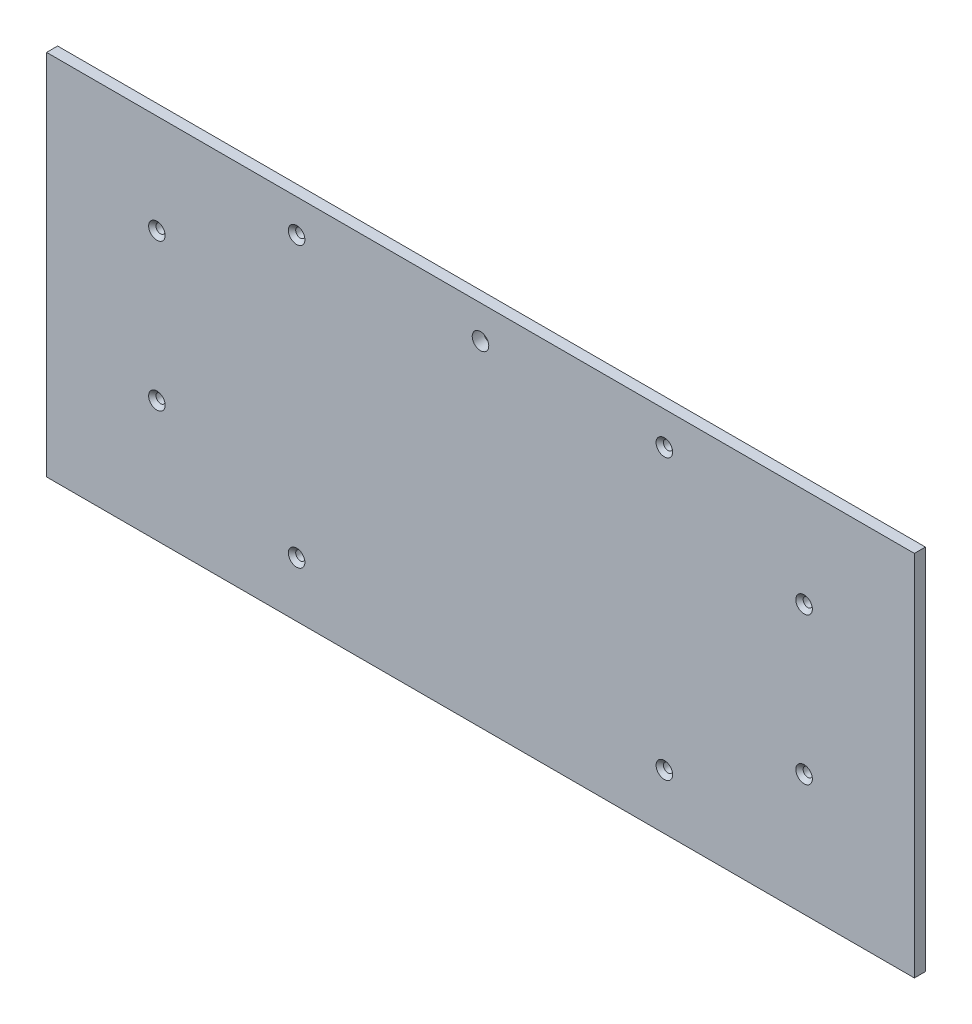
ISO-10303-21;
HEADER;
FILE_DESCRIPTION(('STEP AP214'),'2;1');
FILE_NAME('part.step','',(''),(''),'','','');
FILE_SCHEMA(('AUTOMOTIVE_DESIGN { 1 0 10303 214 1 1 1 1 }'));
ENDSEC;
DATA;
#1=APPLICATION_CONTEXT('core data for automotive mechanical design processes');
#2=APPLICATION_PROTOCOL_DEFINITION('international standard','automotive_design',2000,#1);
#3=PRODUCT_CONTEXT('',#1,'mechanical');
#4=PRODUCT('Part','Part','',(#3));
#5=PRODUCT_RELATED_PRODUCT_CATEGORY('part','',(#4));
#6=PRODUCT_DEFINITION_FORMATION('','',#4);
#7=PRODUCT_DEFINITION_CONTEXT('part definition',#1,'design');
#8=PRODUCT_DEFINITION('design','',#6,#7);
#9=PRODUCT_DEFINITION_SHAPE('','',#8);
#10=(LENGTH_UNIT() NAMED_UNIT(*) SI_UNIT(.MILLI.,.METRE.));
#11=(NAMED_UNIT(*) PLANE_ANGLE_UNIT() SI_UNIT($,.RADIAN.));
#12=(NAMED_UNIT(*) SI_UNIT($,.STERADIAN.) SOLID_ANGLE_UNIT());
#13=UNCERTAINTY_MEASURE_WITH_UNIT(LENGTH_MEASURE(1.E-05),#10,'distance_accuracy_value','');
#14=(GEOMETRIC_REPRESENTATION_CONTEXT(3) GLOBAL_UNCERTAINTY_ASSIGNED_CONTEXT((#13)) GLOBAL_UNIT_ASSIGNED_CONTEXT((#10,
#11,#12)) REPRESENTATION_CONTEXT('',''));
#15=CARTESIAN_POINT('',(0.,0.,0.));
#16=DIRECTION('',(0.,0.,1.));
#17=DIRECTION('',(1.,0.,0.));
#18=AXIS2_PLACEMENT_3D('',#15,#16,#17);
#19=CARTESIAN_POINT('',(236.,-100.,6.));
#20=DIRECTION('',(-1.,0.,0.));
#21=DIRECTION('',(0.,0.,1.));
#22=AXIS2_PLACEMENT_3D('',#19,#20,#21);
#23=PLANE('',#22);
#24=DIRECTION('',(0.,1.,0.));
#25=VECTOR('',#24,1.);
#26=CARTESIAN_POINT('',(236.,-100.,0.));
#27=LINE('',#26,#25);
#28=CARTESIAN_POINT('',(236.,-100.,0.));
#29=VERTEX_POINT('',#28);
#30=CARTESIAN_POINT('',(236.,100.,0.));
#31=VERTEX_POINT('',#30);
#32=EDGE_CURVE('E120',#29,#31,#27,.T.);
#33=ORIENTED_EDGE('',*,*,#32,.T.);
#34=DIRECTION('',(0.,0.,-1.));
#35=VECTOR('',#34,1.);
#36=CARTESIAN_POINT('',(236.,100.,6.));
#37=LINE('',#36,#35);
#38=CARTESIAN_POINT('',(236.,100.,6.));
#39=VERTEX_POINT('',#38);
#40=EDGE_CURVE('E108',#39,#31,#37,.T.);
#41=ORIENTED_EDGE('',*,*,#40,.F.);
#42=DIRECTION('',(0.,1.,0.));
#43=VECTOR('',#42,1.);
#44=CARTESIAN_POINT('',(236.,-100.,6.));
#45=LINE('',#44,#43);
#46=CARTESIAN_POINT('',(236.,-100.,6.));
#47=VERTEX_POINT('',#46);
#48=EDGE_CURVE('E100',#47,#39,#45,.T.);
#49=ORIENTED_EDGE('',*,*,#48,.F.);
#50=DIRECTION('',(0.,0.,-1.));
#51=VECTOR('',#50,1.);
#52=CARTESIAN_POINT('',(236.,-100.,6.));
#53=LINE('',#52,#51);
#54=EDGE_CURVE('E116',#47,#29,#53,.T.);
#55=ORIENTED_EDGE('',*,*,#54,.T.);
#56=EDGE_LOOP('',(#33,#41,#49,#55));
#57=FACE_BOUND('',#56,.T.);
#58=ADVANCED_FACE('F45',(#57),#23,.F.);
#59=CARTESIAN_POINT('',(-236.,100.,6.));
#60=DIRECTION('',(0.,-1.,0.));
#61=DIRECTION('',(0.,0.,-1.));
#62=AXIS2_PLACEMENT_3D('',#59,#60,#61);
#63=PLANE('',#62);
#64=DIRECTION('',(-1.,0.,0.));
#65=VECTOR('',#64,1.);
#66=CARTESIAN_POINT('',(-236.,100.,0.));
#67=LINE('',#66,#65);
#68=CARTESIAN_POINT('',(-236.,100.,0.));
#69=VERTEX_POINT('',#68);
#70=EDGE_CURVE('E106',#31,#69,#67,.T.);
#71=ORIENTED_EDGE('',*,*,#70,.T.);
#72=DIRECTION('',(0.,0.,-1.));
#73=VECTOR('',#72,1.);
#74=CARTESIAN_POINT('',(-236.,100.,6.));
#75=LINE('',#74,#73);
#76=CARTESIAN_POINT('',(-236.,100.,6.));
#77=VERTEX_POINT('',#76);
#78=EDGE_CURVE('E104',#77,#69,#75,.T.);
#79=ORIENTED_EDGE('',*,*,#78,.F.);
#80=DIRECTION('',(-1.,0.,0.));
#81=VECTOR('',#80,1.);
#82=CARTESIAN_POINT('',(-236.,100.,6.));
#83=LINE('',#82,#81);
#84=EDGE_CURVE('E95',#39,#77,#83,.T.);
#85=ORIENTED_EDGE('',*,*,#84,.F.);
#86=ORIENTED_EDGE('',*,*,#40,.T.);
#87=EDGE_LOOP('',(#71,#79,#85,#86));
#88=FACE_BOUND('',#87,.T.);
#89=ADVANCED_FACE('F105',(#88),#63,.F.);
#90=CARTESIAN_POINT('',(-236.,-100.,6.));
#91=DIRECTION('',(1.,0.,0.));
#92=DIRECTION('',(0.,0.,-1.));
#93=AXIS2_PLACEMENT_3D('',#90,#91,#92);
#94=PLANE('',#93);
#95=DIRECTION('',(0.,-1.,0.));
#96=VECTOR('',#95,1.);
#97=CARTESIAN_POINT('',(-236.,-100.,0.));
#98=LINE('',#97,#96);
#99=CARTESIAN_POINT('',(-236.,-100.,0.));
#100=VERTEX_POINT('',#99);
#101=EDGE_CURVE('E81',#69,#100,#98,.T.);
#102=ORIENTED_EDGE('',*,*,#101,.T.);
#103=DIRECTION('',(0.,0.,-1.));
#104=VECTOR('',#103,1.);
#105=CARTESIAN_POINT('',(-236.,-100.,6.));
#106=LINE('',#105,#104);
#107=CARTESIAN_POINT('',(-236.,-100.,6.));
#108=VERTEX_POINT('',#107);
#109=EDGE_CURVE('E109',#108,#100,#106,.T.);
#110=ORIENTED_EDGE('',*,*,#109,.F.);
#111=DIRECTION('',(0.,-1.,0.));
#112=VECTOR('',#111,1.);
#113=CARTESIAN_POINT('',(-236.,-100.,6.));
#114=LINE('',#113,#112);
#115=EDGE_CURVE('E98',#77,#108,#114,.T.);
#116=ORIENTED_EDGE('',*,*,#115,.F.);
#117=ORIENTED_EDGE('',*,*,#78,.T.);
#118=EDGE_LOOP('',(#102,#110,#116,#117));
#119=FACE_BOUND('',#118,.T.);
#120=ADVANCED_FACE('F111',(#119),#94,.F.);
#121=CARTESIAN_POINT('',(-236.,-100.,6.));
#122=DIRECTION('',(0.,1.,0.));
#123=DIRECTION('',(0.,0.,1.));
#124=AXIS2_PLACEMENT_3D('',#121,#122,#123);
#125=PLANE('',#124);
#126=DIRECTION('',(1.,0.,0.));
#127=VECTOR('',#126,1.);
#128=CARTESIAN_POINT('',(-236.,-100.,0.));
#129=LINE('',#128,#127);
#130=EDGE_CURVE('E87',#100,#29,#129,.T.);
#131=ORIENTED_EDGE('',*,*,#130,.T.);
#132=ORIENTED_EDGE('',*,*,#54,.F.);
#133=DIRECTION('',(1.,0.,0.));
#134=VECTOR('',#133,1.);
#135=CARTESIAN_POINT('',(-236.,-100.,6.));
#136=LINE('',#135,#134);
#137=EDGE_CURVE('E64',#108,#47,#136,.T.);
#138=ORIENTED_EDGE('',*,*,#137,.F.);
#139=ORIENTED_EDGE('',*,*,#109,.T.);
#140=EDGE_LOOP('',(#131,#132,#138,#139));
#141=FACE_BOUND('',#140,.T.);
#142=ADVANCED_FACE('F342',(#141),#125,.F.);
#143=CARTESIAN_POINT('',(0.,0.,6.));
#144=DIRECTION('',(0.,0.,-1.));
#145=DIRECTION('',(-1.,0.,0.));
#146=AXIS2_PLACEMENT_3D('',#143,#144,#145);
#147=PLANE('',#146);
#148=CARTESIAN_POINT('',(0.,82.,6.));
#149=DIRECTION('',(0.,0.,1.));
#150=DIRECTION('',(1.,0.,0.));
#151=AXIS2_PLACEMENT_3D('',#148,#149,#150);
#152=CIRCLE('',#151,4.5);
#153=CARTESIAN_POINT('',(4.5,82.,6.));
#154=VERTEX_POINT('',#153);
#155=EDGE_CURVE('E324',#154,#154,#152,.T.);
#156=ORIENTED_EDGE('',*,*,#155,.F.);
#157=EDGE_LOOP('',(#156));
#158=FACE_BOUND('',#157,.T.);
#159=CARTESIAN_POINT('',(-176.,-34.,6.));
#160=DIRECTION('',(0.,0.,-1.));
#161=DIRECTION('',(-1.,0.,0.));
#162=AXIS2_PLACEMENT_3D('',#159,#160,#161);
#163=CIRCLE('',#162,4.49999999999995);
#164=CARTESIAN_POINT('',(-180.5,-34.,6.));
#165=VERTEX_POINT('',#164);
#166=EDGE_CURVE('E169',#165,#165,#163,.T.);
#167=ORIENTED_EDGE('',*,*,#166,.T.);
#168=EDGE_LOOP('',(#167));
#169=FACE_BOUND('',#168,.T.);
#170=CARTESIAN_POINT('',(-176.,46.,6.));
#171=DIRECTION('',(0.,0.,-1.));
#172=DIRECTION('',(-1.,0.,0.));
#173=AXIS2_PLACEMENT_3D('',#170,#171,#172);
#174=CIRCLE('',#173,4.49999999999995);
#175=CARTESIAN_POINT('',(-180.5,46.,6.));
#176=VERTEX_POINT('',#175);
#177=EDGE_CURVE('E165',#176,#176,#174,.T.);
#178=ORIENTED_EDGE('',*,*,#177,.T.);
#179=EDGE_LOOP('',(#178));
#180=FACE_BOUND('',#179,.T.);
#181=CARTESIAN_POINT('',(176.,46.,6.));
#182=DIRECTION('',(0.,0.,-1.));
#183=DIRECTION('',(-1.,0.,0.));
#184=AXIS2_PLACEMENT_3D('',#181,#182,#183);
#185=CIRCLE('',#184,4.49999999999995);
#186=CARTESIAN_POINT('',(171.5,46.,6.));
#187=VERTEX_POINT('',#186);
#188=EDGE_CURVE('E161',#187,#187,#185,.T.);
#189=ORIENTED_EDGE('',*,*,#188,.T.);
#190=EDGE_LOOP('',(#189));
#191=FACE_BOUND('',#190,.T.);
#192=CARTESIAN_POINT('',(176.,-34.,6.));
#193=DIRECTION('',(0.,0.,-1.));
#194=DIRECTION('',(-1.,0.,0.));
#195=AXIS2_PLACEMENT_3D('',#192,#193,#194);
#196=CIRCLE('',#195,4.49999999999995);
#197=CARTESIAN_POINT('',(171.5,-34.,6.));
#198=VERTEX_POINT('',#197);
#199=EDGE_CURVE('E157',#198,#198,#196,.T.);
#200=ORIENTED_EDGE('',*,*,#199,.T.);
#201=EDGE_LOOP('',(#200));
#202=FACE_BOUND('',#201,.T.);
#203=CARTESIAN_POINT('',(100.,82.,6.));
#204=DIRECTION('',(0.,0.,-1.));
#205=DIRECTION('',(-1.,0.,0.));
#206=AXIS2_PLACEMENT_3D('',#203,#204,#205);
#207=CIRCLE('',#206,4.49999999999995);
#208=CARTESIAN_POINT('',(95.5000000000001,82.,6.));
#209=VERTEX_POINT('',#208);
#210=EDGE_CURVE('E153',#209,#209,#207,.T.);
#211=ORIENTED_EDGE('',*,*,#210,.T.);
#212=EDGE_LOOP('',(#211));
#213=FACE_BOUND('',#212,.T.);
#214=CARTESIAN_POINT('',(-100.,82.,6.));
#215=DIRECTION('',(0.,0.,-1.));
#216=DIRECTION('',(-1.,0.,0.));
#217=AXIS2_PLACEMENT_3D('',#214,#215,#216);
#218=CIRCLE('',#217,4.50000000000012);
#219=CARTESIAN_POINT('',(-104.5,82.,6.));
#220=VERTEX_POINT('',#219);
#221=EDGE_CURVE('E149',#220,#220,#218,.T.);
#222=ORIENTED_EDGE('',*,*,#221,.T.);
#223=EDGE_LOOP('',(#222));
#224=FACE_BOUND('',#223,.T.);
#225=CARTESIAN_POINT('',(-100.,-70.,6.));
#226=DIRECTION('',(0.,0.,-1.));
#227=DIRECTION('',(-1.,0.,0.));
#228=AXIS2_PLACEMENT_3D('',#225,#226,#227);
#229=CIRCLE('',#228,4.50000000000012);
#230=CARTESIAN_POINT('',(-104.5,-70.,6.));
#231=VERTEX_POINT('',#230);
#232=EDGE_CURVE('E145',#231,#231,#229,.T.);
#233=ORIENTED_EDGE('',*,*,#232,.T.);
#234=EDGE_LOOP('',(#233));
#235=FACE_BOUND('',#234,.T.);
#236=CARTESIAN_POINT('',(100.,-70.,6.));
#237=DIRECTION('',(0.,0.,-1.));
#238=DIRECTION('',(-1.,0.,0.));
#239=AXIS2_PLACEMENT_3D('',#236,#237,#238);
#240=CIRCLE('',#239,4.49999999999995);
#241=CARTESIAN_POINT('',(95.5000000000001,-70.,6.));
#242=VERTEX_POINT('',#241);
#243=EDGE_CURVE('E141',#242,#242,#240,.T.);
#244=ORIENTED_EDGE('',*,*,#243,.T.);
#245=EDGE_LOOP('',(#244));
#246=FACE_BOUND('',#245,.T.);
#247=ORIENTED_EDGE('',*,*,#48,.T.);
#248=ORIENTED_EDGE('',*,*,#84,.T.);
#249=ORIENTED_EDGE('',*,*,#115,.T.);
#250=ORIENTED_EDGE('',*,*,#137,.T.);
#251=EDGE_LOOP('',(#247,#248,#249,#250));
#252=FACE_BOUND('',#251,.T.);
#253=ADVANCED_FACE('F96',(#158,#169,#180,#191,#202,#213,#224,#235,#246,#252),#147,.F.);
#254=CARTESIAN_POINT('',(0.,0.,0.));
#255=DIRECTION('',(0.,0.,-1.));
#256=DIRECTION('',(-1.,0.,0.));
#257=AXIS2_PLACEMENT_3D('',#254,#255,#256);
#258=PLANE('',#257);
#259=CARTESIAN_POINT('',(0.,82.,0.));
#260=DIRECTION('',(0.,0.,1.));
#261=DIRECTION('',(1.,0.,0.));
#262=AXIS2_PLACEMENT_3D('',#259,#260,#261);
#263=CIRCLE('',#262,4.5);
#264=CARTESIAN_POINT('',(4.5,82.,0.));
#265=VERTEX_POINT('',#264);
#266=EDGE_CURVE('E323',#265,#265,#263,.T.);
#267=ORIENTED_EDGE('',*,*,#266,.T.);
#268=EDGE_LOOP('',(#267));
#269=FACE_BOUND('',#268,.T.);
#270=CARTESIAN_POINT('',(-100.,-70.,0.));
#271=DIRECTION('',(0.,0.,1.));
#272=DIRECTION('',(1.,0.,0.));
#273=AXIS2_PLACEMENT_3D('',#270,#271,#272);
#274=CIRCLE('',#273,2.5);
#275=CARTESIAN_POINT('',(-97.5,-70.,0.));
#276=VERTEX_POINT('',#275);
#277=EDGE_CURVE('E288',#276,#276,#274,.T.);
#278=ORIENTED_EDGE('',*,*,#277,.T.);
#279=EDGE_LOOP('',(#278));
#280=FACE_BOUND('',#279,.T.);
#281=CARTESIAN_POINT('',(-100.,82.,0.));
#282=DIRECTION('',(0.,0.,1.));
#283=DIRECTION('',(1.,0.,0.));
#284=AXIS2_PLACEMENT_3D('',#281,#282,#283);
#285=CIRCLE('',#284,2.5);
#286=CARTESIAN_POINT('',(-97.5,82.,0.));
#287=VERTEX_POINT('',#286);
#288=EDGE_CURVE('E281',#287,#287,#285,.T.);
#289=ORIENTED_EDGE('',*,*,#288,.T.);
#290=EDGE_LOOP('',(#289));
#291=FACE_BOUND('',#290,.T.);
#292=CARTESIAN_POINT('',(100.,82.,0.));
#293=DIRECTION('',(0.,0.,1.));
#294=DIRECTION('',(1.,0.,0.));
#295=AXIS2_PLACEMENT_3D('',#292,#293,#294);
#296=CIRCLE('',#295,2.5);
#297=CARTESIAN_POINT('',(102.5,82.,0.));
#298=VERTEX_POINT('',#297);
#299=EDGE_CURVE('E278',#298,#298,#296,.T.);
#300=ORIENTED_EDGE('',*,*,#299,.T.);
#301=EDGE_LOOP('',(#300));
#302=FACE_BOUND('',#301,.T.);
#303=CARTESIAN_POINT('',(176.,46.,0.));
#304=DIRECTION('',(0.,0.,1.));
#305=DIRECTION('',(1.,0.,0.));
#306=AXIS2_PLACEMENT_3D('',#303,#304,#305);
#307=CIRCLE('',#306,2.5);
#308=CARTESIAN_POINT('',(178.5,46.,0.));
#309=VERTEX_POINT('',#308);
#310=EDGE_CURVE('E282',#309,#309,#307,.T.);
#311=ORIENTED_EDGE('',*,*,#310,.T.);
#312=EDGE_LOOP('',(#311));
#313=FACE_BOUND('',#312,.T.);
#314=CARTESIAN_POINT('',(-176.,-34.,0.));
#315=DIRECTION('',(0.,0.,1.));
#316=DIRECTION('',(1.,0.,0.));
#317=AXIS2_PLACEMENT_3D('',#314,#315,#316);
#318=CIRCLE('',#317,2.5);
#319=CARTESIAN_POINT('',(-173.5,-34.,0.));
#320=VERTEX_POINT('',#319);
#321=EDGE_CURVE('E316',#320,#320,#318,.T.);
#322=ORIENTED_EDGE('',*,*,#321,.T.);
#323=EDGE_LOOP('',(#322));
#324=FACE_BOUND('',#323,.T.);
#325=CARTESIAN_POINT('',(-176.,46.,0.));
#326=DIRECTION('',(0.,0.,1.));
#327=DIRECTION('',(1.,0.,0.));
#328=AXIS2_PLACEMENT_3D('',#325,#326,#327);
#329=CIRCLE('',#328,2.5);
#330=CARTESIAN_POINT('',(-173.5,46.,0.));
#331=VERTEX_POINT('',#330);
#332=EDGE_CURVE('E312',#331,#331,#329,.T.);
#333=ORIENTED_EDGE('',*,*,#332,.T.);
#334=EDGE_LOOP('',(#333));
#335=FACE_BOUND('',#334,.T.);
#336=CARTESIAN_POINT('',(176.,-34.,0.));
#337=DIRECTION('',(0.,0.,1.));
#338=DIRECTION('',(1.,0.,0.));
#339=AXIS2_PLACEMENT_3D('',#336,#337,#338);
#340=CIRCLE('',#339,2.5);
#341=CARTESIAN_POINT('',(178.5,-34.,0.));
#342=VERTEX_POINT('',#341);
#343=EDGE_CURVE('E291',#342,#342,#340,.T.);
#344=ORIENTED_EDGE('',*,*,#343,.T.);
#345=EDGE_LOOP('',(#344));
#346=FACE_BOUND('',#345,.T.);
#347=CARTESIAN_POINT('',(100.,-70.,0.));
#348=DIRECTION('',(0.,0.,1.));
#349=DIRECTION('',(1.,0.,0.));
#350=AXIS2_PLACEMENT_3D('',#347,#348,#349);
#351=CIRCLE('',#350,2.5);
#352=CARTESIAN_POINT('',(102.5,-70.,0.));
#353=VERTEX_POINT('',#352);
#354=EDGE_CURVE('E124',#353,#353,#351,.T.);
#355=ORIENTED_EDGE('',*,*,#354,.T.);
#356=EDGE_LOOP('',(#355));
#357=FACE_BOUND('',#356,.T.);
#358=ORIENTED_EDGE('',*,*,#32,.F.);
#359=ORIENTED_EDGE('',*,*,#130,.F.);
#360=ORIENTED_EDGE('',*,*,#101,.F.);
#361=ORIENTED_EDGE('',*,*,#70,.F.);
#362=EDGE_LOOP('',(#358,#359,#360,#361));
#363=FACE_BOUND('',#362,.T.);
#364=ADVANCED_FACE('F333',(#269,#280,#291,#302,#313,#324,#335,#346,#357,#363),#258,.T.);
#365=CARTESIAN_POINT('',(100.,-70.,0.));
#366=DIRECTION('',(0.,0.,1.));
#367=DIRECTION('',(1.,0.,0.));
#368=AXIS2_PLACEMENT_3D('',#365,#366,#367);
#369=CYLINDRICAL_SURFACE('',#368,2.5);
#370=CARTESIAN_POINT('',(100.,-70.,4.00000000000009));
#371=DIRECTION('',(0.,0.,-1.));
#372=DIRECTION('',(-1.,0.,0.));
#373=AXIS2_PLACEMENT_3D('',#370,#371,#372);
#374=CIRCLE('',#373,2.5);
#375=CARTESIAN_POINT('',(97.5,-70.,4.00000000000009));
#376=VERTEX_POINT('',#375);
#377=EDGE_CURVE('E11',#376,#376,#374,.F.);
#378=ORIENTED_EDGE('',*,*,#377,.T.);
#379=EDGE_LOOP('',(#378));
#380=FACE_BOUND('',#379,.T.);
#381=ORIENTED_EDGE('',*,*,#354,.F.);
#382=EDGE_LOOP('',(#381));
#383=FACE_BOUND('',#382,.T.);
#384=ADVANCED_FACE('F360',(#380,#383),#369,.F.);
#385=CARTESIAN_POINT('',(176.,-34.,0.));
#386=DIRECTION('',(0.,0.,1.));
#387=DIRECTION('',(1.,0.,0.));
#388=AXIS2_PLACEMENT_3D('',#385,#386,#387);
#389=CYLINDRICAL_SURFACE('',#388,2.5);
#390=CARTESIAN_POINT('',(176.,-34.,4.00000000000009));
#391=DIRECTION('',(0.,0.,-1.));
#392=DIRECTION('',(-1.,0.,0.));
#393=AXIS2_PLACEMENT_3D('',#390,#391,#392);
#394=CIRCLE('',#393,2.5);
#395=CARTESIAN_POINT('',(173.5,-34.,4.00000000000009));
#396=VERTEX_POINT('',#395);
#397=EDGE_CURVE('E181',#396,#396,#394,.F.);
#398=ORIENTED_EDGE('',*,*,#397,.T.);
#399=EDGE_LOOP('',(#398));
#400=FACE_BOUND('',#399,.T.);
#401=ORIENTED_EDGE('',*,*,#343,.F.);
#402=EDGE_LOOP('',(#401));
#403=FACE_BOUND('',#402,.T.);
#404=ADVANCED_FACE('F363',(#400,#403),#389,.F.);
#405=CARTESIAN_POINT('',(-176.,46.,0.));
#406=DIRECTION('',(0.,0.,1.));
#407=DIRECTION('',(1.,0.,0.));
#408=AXIS2_PLACEMENT_3D('',#405,#406,#407);
#409=CYLINDRICAL_SURFACE('',#408,2.5);
#410=CARTESIAN_POINT('',(-176.,46.,4.00000000000009));
#411=DIRECTION('',(0.,0.,-1.));
#412=DIRECTION('',(-1.,0.,0.));
#413=AXIS2_PLACEMENT_3D('',#410,#411,#412);
#414=CIRCLE('',#413,2.5);
#415=CARTESIAN_POINT('',(-178.5,46.,4.00000000000009));
#416=VERTEX_POINT('',#415);
#417=EDGE_CURVE('E173',#416,#416,#414,.F.);
#418=ORIENTED_EDGE('',*,*,#417,.T.);
#419=EDGE_LOOP('',(#418));
#420=FACE_BOUND('',#419,.T.);
#421=ORIENTED_EDGE('',*,*,#332,.F.);
#422=EDGE_LOOP('',(#421));
#423=FACE_BOUND('',#422,.T.);
#424=ADVANCED_FACE('F386',(#420,#423),#409,.F.);
#425=CARTESIAN_POINT('',(-176.,-34.,0.));
#426=DIRECTION('',(0.,0.,1.));
#427=DIRECTION('',(1.,0.,0.));
#428=AXIS2_PLACEMENT_3D('',#425,#426,#427);
#429=CYLINDRICAL_SURFACE('',#428,2.5);
#430=CARTESIAN_POINT('',(-176.,-34.,4.00000000000009));
#431=DIRECTION('',(0.,0.,-1.));
#432=DIRECTION('',(-1.,0.,0.));
#433=AXIS2_PLACEMENT_3D('',#430,#431,#432);
#434=CIRCLE('',#433,2.5);
#435=CARTESIAN_POINT('',(-178.5,-34.,4.00000000000009));
#436=VERTEX_POINT('',#435);
#437=EDGE_CURVE('E137',#436,#436,#434,.F.);
#438=ORIENTED_EDGE('',*,*,#437,.T.);
#439=EDGE_LOOP('',(#438));
#440=FACE_BOUND('',#439,.T.);
#441=ORIENTED_EDGE('',*,*,#321,.F.);
#442=EDGE_LOOP('',(#441));
#443=FACE_BOUND('',#442,.T.);
#444=ADVANCED_FACE('F378',(#440,#443),#429,.F.);
#445=CARTESIAN_POINT('',(176.,46.,0.));
#446=DIRECTION('',(0.,0.,1.));
#447=DIRECTION('',(1.,0.,0.));
#448=AXIS2_PLACEMENT_3D('',#445,#446,#447);
#449=CYLINDRICAL_SURFACE('',#448,2.5);
#450=CARTESIAN_POINT('',(176.,46.,4.00000000000009));
#451=DIRECTION('',(0.,0.,-1.));
#452=DIRECTION('',(-1.,0.,0.));
#453=AXIS2_PLACEMENT_3D('',#450,#451,#452);
#454=CIRCLE('',#453,2.5);
#455=CARTESIAN_POINT('',(173.5,46.,4.00000000000009));
#456=VERTEX_POINT('',#455);
#457=EDGE_CURVE('E177',#456,#456,#454,.F.);
#458=ORIENTED_EDGE('',*,*,#457,.T.);
#459=EDGE_LOOP('',(#458));
#460=FACE_BOUND('',#459,.T.);
#461=ORIENTED_EDGE('',*,*,#310,.F.);
#462=EDGE_LOOP('',(#461));
#463=FACE_BOUND('',#462,.T.);
#464=ADVANCED_FACE('F274',(#460,#463),#449,.F.);
#465=CARTESIAN_POINT('',(100.,82.,0.));
#466=DIRECTION('',(0.,0.,1.));
#467=DIRECTION('',(1.,0.,0.));
#468=AXIS2_PLACEMENT_3D('',#465,#466,#467);
#469=CYLINDRICAL_SURFACE('',#468,2.5);
#470=CARTESIAN_POINT('',(100.,82.,4.00000000000009));
#471=DIRECTION('',(0.,0.,-1.));
#472=DIRECTION('',(-1.,0.,0.));
#473=AXIS2_PLACEMENT_3D('',#470,#471,#472);
#474=CIRCLE('',#473,2.5);
#475=CARTESIAN_POINT('',(97.5,82.,4.00000000000009));
#476=VERTEX_POINT('',#475);
#477=EDGE_CURVE('E185',#476,#476,#474,.F.);
#478=ORIENTED_EDGE('',*,*,#477,.T.);
#479=EDGE_LOOP('',(#478));
#480=FACE_BOUND('',#479,.T.);
#481=ORIENTED_EDGE('',*,*,#299,.F.);
#482=EDGE_LOOP('',(#481));
#483=FACE_BOUND('',#482,.T.);
#484=ADVANCED_FACE('F270',(#480,#483),#469,.F.);
#485=CARTESIAN_POINT('',(-100.,82.,0.));
#486=DIRECTION('',(0.,0.,1.));
#487=DIRECTION('',(1.,0.,0.));
#488=AXIS2_PLACEMENT_3D('',#485,#486,#487);
#489=CYLINDRICAL_SURFACE('',#488,2.5);
#490=CARTESIAN_POINT('',(-100.,82.,3.99999999999993));
#491=DIRECTION('',(0.,0.,-1.));
#492=DIRECTION('',(-1.,0.,0.));
#493=AXIS2_PLACEMENT_3D('',#490,#491,#492);
#494=CIRCLE('',#493,2.5);
#495=CARTESIAN_POINT('',(-102.5,82.,3.99999999999993));
#496=VERTEX_POINT('',#495);
#497=EDGE_CURVE('E189',#496,#496,#494,.F.);
#498=ORIENTED_EDGE('',*,*,#497,.T.);
#499=EDGE_LOOP('',(#498));
#500=FACE_BOUND('',#499,.T.);
#501=ORIENTED_EDGE('',*,*,#288,.F.);
#502=EDGE_LOOP('',(#501));
#503=FACE_BOUND('',#502,.T.);
#504=ADVANCED_FACE('F273',(#500,#503),#489,.F.);
#505=CARTESIAN_POINT('',(-100.,-70.,0.));
#506=DIRECTION('',(0.,0.,1.));
#507=DIRECTION('',(1.,0.,0.));
#508=AXIS2_PLACEMENT_3D('',#505,#506,#507);
#509=CYLINDRICAL_SURFACE('',#508,2.5);
#510=CARTESIAN_POINT('',(-100.,-70.,3.99999999999993));
#511=DIRECTION('',(0.,0.,-1.));
#512=DIRECTION('',(-1.,0.,0.));
#513=AXIS2_PLACEMENT_3D('',#510,#511,#512);
#514=CIRCLE('',#513,2.5);
#515=CARTESIAN_POINT('',(-102.5,-70.,3.99999999999993));
#516=VERTEX_POINT('',#515);
#517=EDGE_CURVE('E56',#516,#516,#514,.F.);
#518=ORIENTED_EDGE('',*,*,#517,.T.);
#519=EDGE_LOOP('',(#518));
#520=FACE_BOUND('',#519,.T.);
#521=ORIENTED_EDGE('',*,*,#277,.F.);
#522=EDGE_LOOP('',(#521));
#523=FACE_BOUND('',#522,.T.);
#524=ADVANCED_FACE('F197',(#520,#523),#509,.F.);
#525=CARTESIAN_POINT('',(-176.,-34.,4.00000000000009));
#526=DIRECTION('',(0.,0.,1.));
#527=DIRECTION('',(1.,0.,0.));
#528=AXIS2_PLACEMENT_3D('',#525,#526,#527);
#529=CONICAL_SURFACE('',#528,2.5,0.78539816339746);
#530=ORIENTED_EDGE('',*,*,#166,.F.);
#531=EDGE_LOOP('',(#530));
#532=FACE_BOUND('',#531,.T.);
#533=ORIENTED_EDGE('',*,*,#437,.F.);
#534=EDGE_LOOP('',(#533));
#535=FACE_BOUND('',#534,.T.);
#536=ADVANCED_FACE('F225',(#532,#535),#529,.F.);
#537=CARTESIAN_POINT('',(-176.,46.,4.00000000000009));
#538=DIRECTION('',(0.,0.,1.));
#539=DIRECTION('',(1.,0.,0.));
#540=AXIS2_PLACEMENT_3D('',#537,#538,#539);
#541=CONICAL_SURFACE('',#540,2.5,0.78539816339746);
#542=ORIENTED_EDGE('',*,*,#177,.F.);
#543=EDGE_LOOP('',(#542));
#544=FACE_BOUND('',#543,.T.);
#545=ORIENTED_EDGE('',*,*,#417,.F.);
#546=EDGE_LOOP('',(#545));
#547=FACE_BOUND('',#546,.T.);
#548=ADVANCED_FACE('F231',(#544,#547),#541,.F.);
#549=CARTESIAN_POINT('',(176.,46.,4.00000000000009));
#550=DIRECTION('',(0.,0.,1.));
#551=DIRECTION('',(1.,0.,0.));
#552=AXIS2_PLACEMENT_3D('',#549,#550,#551);
#553=CONICAL_SURFACE('',#552,2.5,0.78539816339746);
#554=ORIENTED_EDGE('',*,*,#188,.F.);
#555=EDGE_LOOP('',(#554));
#556=FACE_BOUND('',#555,.T.);
#557=ORIENTED_EDGE('',*,*,#457,.F.);
#558=EDGE_LOOP('',(#557));
#559=FACE_BOUND('',#558,.T.);
#560=ADVANCED_FACE('F238',(#556,#559),#553,.F.);
#561=CARTESIAN_POINT('',(176.,-34.,4.00000000000009));
#562=DIRECTION('',(0.,0.,1.));
#563=DIRECTION('',(1.,0.,0.));
#564=AXIS2_PLACEMENT_3D('',#561,#562,#563);
#565=CONICAL_SURFACE('',#564,2.5,0.78539816339746);
#566=ORIENTED_EDGE('',*,*,#199,.F.);
#567=EDGE_LOOP('',(#566));
#568=FACE_BOUND('',#567,.T.);
#569=ORIENTED_EDGE('',*,*,#397,.F.);
#570=EDGE_LOOP('',(#569));
#571=FACE_BOUND('',#570,.T.);
#572=ADVANCED_FACE('F245',(#568,#571),#565,.F.);
#573=CARTESIAN_POINT('',(100.,82.,4.00000000000009));
#574=DIRECTION('',(0.,0.,1.));
#575=DIRECTION('',(1.,0.,0.));
#576=AXIS2_PLACEMENT_3D('',#573,#574,#575);
#577=CONICAL_SURFACE('',#576,2.5,0.78539816339746);
#578=ORIENTED_EDGE('',*,*,#210,.F.);
#579=EDGE_LOOP('',(#578));
#580=FACE_BOUND('',#579,.T.);
#581=ORIENTED_EDGE('',*,*,#477,.F.);
#582=EDGE_LOOP('',(#581));
#583=FACE_BOUND('',#582,.T.);
#584=ADVANCED_FACE('F210',(#580,#583),#577,.F.);
#585=CARTESIAN_POINT('',(-100.,82.,3.99999999999993));
#586=DIRECTION('',(0.,0.,1.));
#587=DIRECTION('',(1.,0.,0.));
#588=AXIS2_PLACEMENT_3D('',#585,#586,#587);
#589=CONICAL_SURFACE('',#588,2.5,0.78539816339746);
#590=ORIENTED_EDGE('',*,*,#221,.F.);
#591=EDGE_LOOP('',(#590));
#592=FACE_BOUND('',#591,.T.);
#593=ORIENTED_EDGE('',*,*,#497,.F.);
#594=EDGE_LOOP('',(#593));
#595=FACE_BOUND('',#594,.T.);
#596=ADVANCED_FACE('F202',(#592,#595),#589,.F.);
#597=CARTESIAN_POINT('',(-100.,-70.,3.99999999999993));
#598=DIRECTION('',(0.,0.,1.));
#599=DIRECTION('',(1.,0.,0.));
#600=AXIS2_PLACEMENT_3D('',#597,#598,#599);
#601=CONICAL_SURFACE('',#600,2.5,0.78539816339746);
#602=ORIENTED_EDGE('',*,*,#232,.F.);
#603=EDGE_LOOP('',(#602));
#604=FACE_BOUND('',#603,.T.);
#605=ORIENTED_EDGE('',*,*,#517,.F.);
#606=EDGE_LOOP('',(#605));
#607=FACE_BOUND('',#606,.T.);
#608=ADVANCED_FACE('F200',(#604,#607),#601,.F.);
#609=CARTESIAN_POINT('',(100.,-70.,4.00000000000009));
#610=DIRECTION('',(0.,0.,1.));
#611=DIRECTION('',(1.,0.,0.));
#612=AXIS2_PLACEMENT_3D('',#609,#610,#611);
#613=CONICAL_SURFACE('',#612,2.5,0.78539816339746);
#614=ORIENTED_EDGE('',*,*,#243,.F.);
#615=EDGE_LOOP('',(#614));
#616=FACE_BOUND('',#615,.T.);
#617=ORIENTED_EDGE('',*,*,#377,.F.);
#618=EDGE_LOOP('',(#617));
#619=FACE_BOUND('',#618,.T.);
#620=ADVANCED_FACE('F48',(#616,#619),#613,.F.);
#621=CARTESIAN_POINT('',(0.,82.,0.));
#622=DIRECTION('',(0.,0.,1.));
#623=DIRECTION('',(1.,0.,0.));
#624=AXIS2_PLACEMENT_3D('',#621,#622,#623);
#625=CYLINDRICAL_SURFACE('',#624,4.5);
#626=ORIENTED_EDGE('',*,*,#266,.F.);
#627=EDGE_LOOP('',(#626));
#628=FACE_BOUND('',#627,.T.);
#629=ORIENTED_EDGE('',*,*,#155,.T.);
#630=EDGE_LOOP('',(#629));
#631=FACE_BOUND('',#630,.T.);
#632=ADVANCED_FACE('F208',(#628,#631),#625,.F.);
#633=CLOSED_SHELL('',(#58,#89,#120,#142,#253,#364,#384,#404,#424,#444,#464,#484,#504,#524,#536,
#548,#560,#572,#584,#596,#608,#620,#632));
#634=MANIFOLD_SOLID_BREP('B2',#633);
#635=ADVANCED_BREP_SHAPE_REPRESENTATION('',(#18,#634),#14);
#636=SHAPE_DEFINITION_REPRESENTATION(#9,#635);
ENDSEC;
END-ISO-10303-21;
